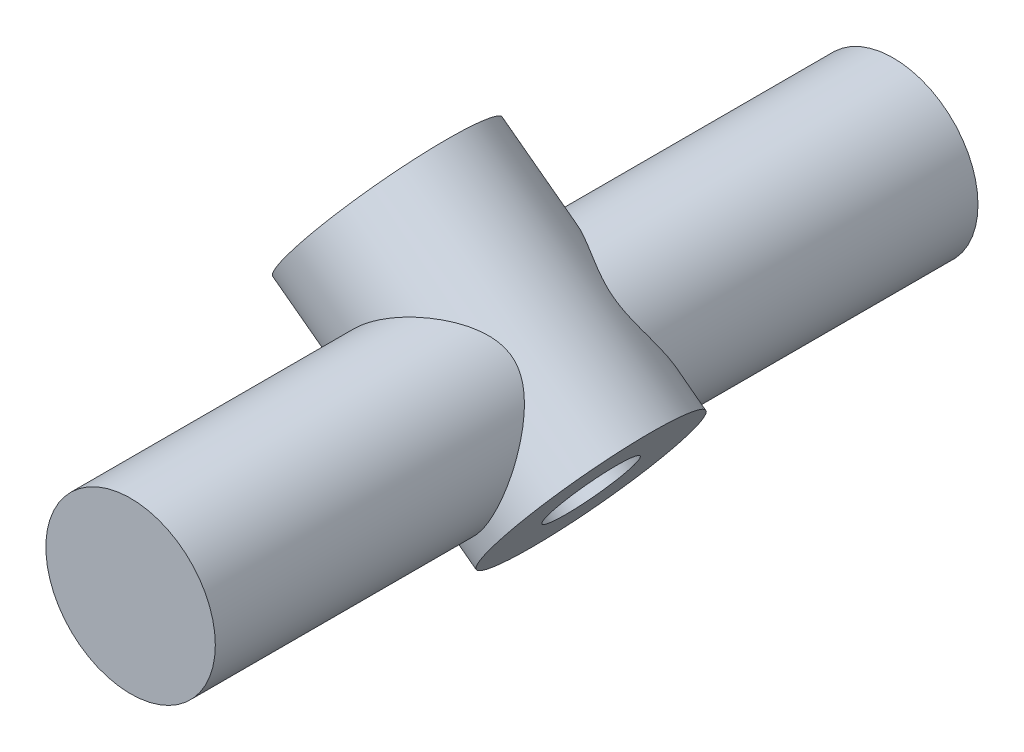
ISO-10303-21;
HEADER;
FILE_DESCRIPTION(('STEP AP214'),'2;1');
FILE_NAME('part.step','',(''),(''),'','','');
FILE_SCHEMA(('AUTOMOTIVE_DESIGN { 1 0 10303 214 1 1 1 1 }'));
ENDSEC;
DATA;
#1=APPLICATION_CONTEXT('core data for automotive mechanical design processes');
#2=APPLICATION_PROTOCOL_DEFINITION('international standard','automotive_design',2000,#1);
#3=PRODUCT_CONTEXT('',#1,'mechanical');
#4=PRODUCT('Part','Part','',(#3));
#5=PRODUCT_RELATED_PRODUCT_CATEGORY('part','',(#4));
#6=PRODUCT_DEFINITION_FORMATION('','',#4);
#7=PRODUCT_DEFINITION_CONTEXT('part definition',#1,'design');
#8=PRODUCT_DEFINITION('design','',#6,#7);
#9=PRODUCT_DEFINITION_SHAPE('','',#8);
#10=(LENGTH_UNIT() NAMED_UNIT(*) SI_UNIT(.MILLI.,.METRE.));
#11=(NAMED_UNIT(*) PLANE_ANGLE_UNIT() SI_UNIT($,.RADIAN.));
#12=(NAMED_UNIT(*) SI_UNIT($,.STERADIAN.) SOLID_ANGLE_UNIT());
#13=UNCERTAINTY_MEASURE_WITH_UNIT(LENGTH_MEASURE(1.E-05),#10,'distance_accuracy_value','');
#14=(GEOMETRIC_REPRESENTATION_CONTEXT(3) GLOBAL_UNCERTAINTY_ASSIGNED_CONTEXT((#13)) GLOBAL_UNIT_ASSIGNED_CONTEXT((#10,
#11,#12)) REPRESENTATION_CONTEXT('',''));
#15=CARTESIAN_POINT('',(0.,0.,0.));
#16=DIRECTION('',(0.,0.,1.));
#17=DIRECTION('',(1.,0.,0.));
#18=AXIS2_PLACEMENT_3D('',#15,#16,#17);
#19=CARTESIAN_POINT('',(-215.759160385557,344.756610233824,-27.));
#20=DIRECTION('',(0.,0.,1.));
#21=DIRECTION('',(1.,0.,0.));
#22=AXIS2_PLACEMENT_3D('',#19,#20,#21);
#23=CYLINDRICAL_SURFACE('',#22,6.00000000000001);
#24=CARTESIAN_POINT('',(-209.759160385557,344.756610233824,-6.00647164745907));
#25=CARTESIAN_POINT('',(-209.759159858271,344.948593905434,-5.91447663587483));
#26=CARTESIAN_POINT('',(-209.768371418057,345.138782135588,-5.8186259193337));
#27=CARTESIAN_POINT('',(-209.804243999186,345.514667969445,-5.62149603390164));
#28=CARTESIAN_POINT('',(-209.8309128451,345.700363520755,-5.5202144495263));
#29=CARTESIAN_POINT('',(-209.901121366976,346.067507634996,-5.31408722450067));
#30=CARTESIAN_POINT('',(-209.944728693377,346.248936034238,-5.20922885008379));
#31=CARTESIAN_POINT('',(-210.048421747259,346.606506576496,-4.99882773495179));
#32=CARTESIAN_POINT('',(-210.10850028618,346.782650988491,-4.89328531235097));
#33=CARTESIAN_POINT('',(-210.228797909086,347.087948865648,-4.7095229299941));
#34=CARTESIAN_POINT('',(-210.285507085904,347.21821392427,-4.63083744523253));
#35=CARTESIAN_POINT('',(-210.408786050194,347.475781172776,-4.47629668838633));
#36=CARTESIAN_POINT('',(-210.475357324651,347.603082912503,-4.40044184526197));
#37=CARTESIAN_POINT('',(-210.618632424391,347.854321516628,-4.25379998566272));
#38=CARTESIAN_POINT('',(-210.69530656222,347.978267004345,-4.18299902347914));
#39=CARTESIAN_POINT('',(-210.859500242439,348.222882098244,-4.04890148969238));
#40=CARTESIAN_POINT('',(-210.947012958609,348.34355370854,-3.98560024337552));
#41=CARTESIAN_POINT('',(-211.1544320968,348.607646267708,-3.85699658342909));
#42=CARTESIAN_POINT('',(-211.277221246331,348.750191045881,-3.79435214128499));
#43=CARTESIAN_POINT('',(-211.474471129644,348.957866042699,-3.71836269486118));
#44=CARTESIAN_POINT('',(-211.542348953018,349.026023744164,-3.69603803114081));
#45=CARTESIAN_POINT('',(-211.682308175847,349.159863176358,-3.65828682890597));
#46=CARTESIAN_POINT('',(-211.754387365384,349.225546179371,-3.64285670023001));
#47=CARTESIAN_POINT('',(-211.903181250009,349.354568828724,-3.61952771383037));
#48=CARTESIAN_POINT('',(-211.979937230506,349.417875956374,-3.61171104940692));
#49=CARTESIAN_POINT('',(-212.136758239871,349.54076366067,-3.60433802030662));
#50=CARTESIAN_POINT('',(-212.216823076003,349.600344453863,-3.60478117518142));
#51=CARTESIAN_POINT('',(-212.379552039737,349.715256762783,-3.61390407720157));
#52=CARTESIAN_POINT('',(-212.462217591644,349.770585890874,-3.62258841638526));
#53=CARTESIAN_POINT('',(-212.629373096039,349.876594338119,-3.64771818999826));
#54=CARTESIAN_POINT('',(-212.713864059663,349.927270994116,-3.66416803685714));
#55=CARTESIAN_POINT('',(-212.899785291929,350.032728195016,-3.70771772941904));
#56=CARTESIAN_POINT('',(-213.001444040587,350.086519686927,-3.73622911991726));
#57=CARTESIAN_POINT('',(-213.205584826696,350.187285260274,-3.80138227926526));
#58=CARTESIAN_POINT('',(-213.308067475727,350.234253664309,-3.83803075549561));
#59=CARTESIAN_POINT('',(-213.513607978219,350.321680368566,-3.91789737479342));
#60=CARTESIAN_POINT('',(-213.616666638258,350.362119539981,-3.9611341252705));
#61=CARTESIAN_POINT('',(-213.822802336345,350.436621209193,-4.05260149255457));
#62=CARTESIAN_POINT('',(-213.925879364181,350.470685222395,-4.10083091833606));
#63=CARTESIAN_POINT('',(-214.20151436605,350.553699448683,-4.23481105677626));
#64=CARTESIAN_POINT('',(-214.374077776183,350.597208808759,-4.32394192250417));
#65=CARTESIAN_POINT('',(-214.719297445024,350.668442857976,-4.50818389996287));
#66=CARTESIAN_POINT('',(-214.891953692639,350.696157447706,-4.60329879491396));
#67=CARTESIAN_POINT('',(-215.237740433117,350.73644706711,-4.79637103997042));
#68=CARTESIAN_POINT('',(-215.410871251562,350.749001574393,-4.89433205973189));
#69=CARTESIAN_POINT('',(-215.757407932876,350.759112427271,-5.09043486384047));
#70=CARTESIAN_POINT('',(-215.93081372361,350.756672209767,-5.18857660161047));
#71=CARTESIAN_POINT('',(-216.28639439189,350.736182213988,-5.3877824121314));
#72=CARTESIAN_POINT('',(-216.468579646611,350.717367934737,-5.48875163616689));
#73=CARTESIAN_POINT('',(-216.832758104092,350.662648665333,-5.68646141227863));
#74=CARTESIAN_POINT('',(-217.014751262974,350.62674037563,-5.78320114402428));
#75=CARTESIAN_POINT('',(-217.377239340965,350.537317912235,-5.97008018853172));
#76=CARTESIAN_POINT('',(-217.557736857007,350.483847640792,-6.06023528181702));
#77=CARTESIAN_POINT('',(-217.91639888987,350.358606159861,-6.23202850296414));
#78=CARTESIAN_POINT('',(-218.09456453088,350.286844138214,-6.31367087779082));
#79=CARTESIAN_POINT('',(-218.392686647987,350.149438014772,-6.4427705537816));
#80=CARTESIAN_POINT('',(-218.513705894415,350.088690702509,-6.49302312687098));
#81=CARTESIAN_POINT('',(-218.753076299836,349.95805677522,-6.58762374336629));
#82=CARTESIAN_POINT('',(-218.871428161373,349.888172600462,-6.63197335697164));
#83=CARTESIAN_POINT('',(-219.104630075343,349.739276796191,-6.71402137125864));
#84=CARTESIAN_POINT('',(-219.21948074301,349.660266782102,-6.75172094613065));
#85=CARTESIAN_POINT('',(-219.444715036771,349.493310025896,-6.81975321083471));
#86=CARTESIAN_POINT('',(-219.555100788681,349.405367608363,-6.85008944170994));
#87=CARTESIAN_POINT('',(-219.771229506971,349.220206465296,-6.90297634785517));
#88=CARTESIAN_POINT('',(-219.876933710721,349.122926008609,-6.92546990660069));
#89=CARTESIAN_POINT('',(-220.081807164013,348.920201168637,-6.96185517887692));
#90=CARTESIAN_POINT('',(-220.180976421702,348.814756795532,-6.97574690313176));
#91=CARTESIAN_POINT('',(-220.371745320491,348.596539330559,-6.9945895914405));
#92=CARTESIAN_POINT('',(-220.463347581818,348.483768799892,-6.99954366282681));
#93=CARTESIAN_POINT('',(-220.638129538941,348.251855310516,-7.00039593743066));
#94=CARTESIAN_POINT('',(-220.721309929685,348.132712878839,-6.99629488848925));
#95=CARTESIAN_POINT('',(-220.870311589157,347.901921542961,-6.98004159646666));
#96=CARTESIAN_POINT('',(-220.937038532873,347.790792033181,-6.96877620523247));
#97=CARTESIAN_POINT('',(-221.062831639844,347.565126624847,-6.93928819421719));
#98=CARTESIAN_POINT('',(-221.121895265833,347.450589613445,-6.9210632780261));
#99=CARTESIAN_POINT('',(-221.232092504991,347.219017251343,-6.87799775481005));
#100=CARTESIAN_POINT('',(-221.283228306581,347.101982600283,-6.85315897866011));
#101=CARTESIAN_POINT('',(-221.377515982412,346.866167515109,-6.79729752438298));
#102=CARTESIAN_POINT('',(-221.420664814467,346.74738643431,-6.76627249926165));
#103=CARTESIAN_POINT('',(-221.540695160261,346.381718429294,-6.6624142236383));
#104=CARTESIAN_POINT('',(-221.604579577354,346.133084435727,-6.58023702844769));
#105=CARTESIAN_POINT('',(-221.699604755759,345.636996731507,-6.39638638942296));
#106=CARTESIAN_POINT('',(-221.730734713972,345.389543437044,-6.29470652627032));
#107=CARTESIAN_POINT('',(-221.758368628146,344.962973873381,-6.10502209456553));
#108=CARTESIAN_POINT('',(-221.761758695785,344.782777842146,-6.02030951079804));
#109=CARTESIAN_POINT('',(-221.752695090741,344.425823719942,-5.84471441732249));
#110=CARTESIAN_POINT('',(-221.740240427143,344.249065844694,-5.75383152206506));
#111=CARTESIAN_POINT('',(-221.700176248336,343.89900639442,-5.5674166059827));
#112=CARTESIAN_POINT('',(-221.672513967593,343.725719043154,-5.47186945953159));
#113=CARTESIAN_POINT('',(-221.602558721917,343.383591207971,-5.27830680778514));
#114=CARTESIAN_POINT('',(-221.560268268297,343.214749966111,-5.18029172885204));
#115=CARTESIAN_POINT('',(-221.460319127498,342.878254856932,-4.98181490380185));
#116=CARTESIAN_POINT('',(-221.402367900583,342.71069349236,-4.88134365814771));
#117=CARTESIAN_POINT('',(-221.271365531515,342.380223459484,-4.68238434409162));
#118=CARTESIAN_POINT('',(-221.198307136395,342.217317068955,-4.58389725330123));
#119=CARTESIAN_POINT('',(-221.036783523802,341.896751284927,-4.39251587168615));
#120=CARTESIAN_POINT('',(-220.948372723991,341.739075626156,-4.29960333618369));
#121=CARTESIAN_POINT('',(-220.755012131261,341.428715810968,-4.12349614686668));
#122=CARTESIAN_POINT('',(-220.650082607611,341.276025810572,-4.0402897981276));
#123=CARTESIAN_POINT('',(-220.424411087476,340.979124815451,-3.89114953062832));
#124=CARTESIAN_POINT('',(-220.304034989525,340.834804430967,-3.8248981186523));
#125=CARTESIAN_POINT('',(-220.110216051287,340.624128122568,-3.74268024418843));
#126=CARTESIAN_POINT('',(-220.043459566578,340.554923357893,-3.71814700359334));
#127=CARTESIAN_POINT('',(-219.905622918109,340.418844144823,-3.67574691211203));
#128=CARTESIAN_POINT('',(-219.834545019292,340.351968504107,-3.65787660348516));
#129=CARTESIAN_POINT('',(-219.687472180485,340.220287540374,-3.62947481990895));
#130=CARTESIAN_POINT('',(-219.611428246185,340.155516949553,-3.61903452957399));
#131=CARTESIAN_POINT('',(-219.455773332999,340.029552653851,-3.60642726278701));
#132=CARTESIAN_POINT('',(-219.376162651854,339.968358651386,-3.60425959706073));
#133=CARTESIAN_POINT('',(-219.214088487381,339.850131243976,-3.60832485392698));
#134=CARTESIAN_POINT('',(-219.131624280996,339.793098905108,-3.61455992110577));
#135=CARTESIAN_POINT('',(-218.964620731158,339.683642464384,-3.63507666911775));
#136=CARTESIAN_POINT('',(-218.88008028501,339.631220882109,-3.64936271827031));
#137=CARTESIAN_POINT('',(-218.69771500465,339.524250753239,-3.687754703712));
#138=CARTESIAN_POINT('',(-218.599691786493,339.470437247869,-3.71295789286757));
#139=CARTESIAN_POINT('',(-218.402694225675,339.369216409363,-3.77142101301842));
#140=CARTESIAN_POINT('',(-218.303719201083,339.321814103271,-3.80468720983686));
#141=CARTESIAN_POINT('',(-218.105110724999,339.233171090331,-3.87784148606014));
#142=CARTESIAN_POINT('',(-218.005476198344,339.191948509933,-3.91774834844116));
#143=CARTESIAN_POINT('',(-217.806134248811,339.115574132088,-4.00269544360038));
#144=CARTESIAN_POINT('',(-217.706426846165,339.080421033773,-4.04773457293988));
#145=CARTESIAN_POINT('',(-217.439855414804,338.994141524659,-4.17338722236864));
#146=CARTESIAN_POINT('',(-217.272972898945,338.948195134383,-4.25753622351755));
#147=CARTESIAN_POINT('',(-216.939166298955,338.871294435975,-4.43239029199889));
#148=CARTESIAN_POINT('',(-216.772242260179,338.840350050726,-4.52309965314518));
#149=CARTESIAN_POINT('',(-216.437985401882,338.792742004405,-4.70798715610268));
#150=CARTESIAN_POINT('',(-216.270652337613,338.776098486845,-4.80216999651638));
#151=CARTESIAN_POINT('',(-215.935739837939,338.75686498243,-4.9914127910159));
#152=CARTESIAN_POINT('',(-215.768160468645,338.754271738416,-5.08647253669702));
#153=CARTESIAN_POINT('',(-215.422721036166,338.763412737118,-5.28115655833267));
#154=CARTESIAN_POINT('',(-215.244845063938,338.776012445772,-5.38071413047635));
#155=CARTESIAN_POINT('',(-214.889087577021,338.817330946008,-5.57653831294002));
#156=CARTESIAN_POINT('',(-214.711206066921,338.846052589966,-5.67280433770428));
#157=CARTESIAN_POINT('',(-214.356506554987,338.920061004817,-5.85983205896735));
#158=CARTESIAN_POINT('',(-214.179687046037,338.965309384258,-5.95060594852192));
#159=CARTESIAN_POINT('',(-213.827664605067,339.073021286913,-6.12491879989516));
#160=CARTESIAN_POINT('',(-213.652461593187,339.135483954924,-6.20845812085507));
#161=CARTESIAN_POINT('',(-213.352537609025,339.258719055204,-6.34469923358174));
#162=CARTESIAN_POINT('',(-213.227083529484,339.315304256274,-6.39959658151361));
#163=CARTESIAN_POINT('',(-212.978510941205,339.438039852364,-6.50365773552214));
#164=CARTESIAN_POINT('',(-212.855391853686,339.504187841028,-6.55282297840512));
#165=CARTESIAN_POINT('',(-212.612308282845,339.646118464223,-6.64460845088783));
#166=CARTESIAN_POINT('',(-212.492343450518,339.721900027376,-6.68722940713412));
#167=CARTESIAN_POINT('',(-212.256552892906,339.88299601457,-6.7651224640722));
#168=CARTESIAN_POINT('',(-212.140725467603,339.968306462414,-6.800397612539));
#169=CARTESIAN_POINT('',(-211.913285175618,340.148953403415,-6.86314226006092));
#170=CARTESIAN_POINT('',(-211.801714212646,340.244365746207,-6.89054599026212));
#171=CARTESIAN_POINT('',(-211.584921066561,340.444134269169,-6.93652674027109));
#172=CARTESIAN_POINT('',(-211.479698893163,340.548490463023,-6.95510374657244));
#173=CARTESIAN_POINT('',(-211.276782213824,340.765329676951,-6.98296050653346));
#174=CARTESIAN_POINT('',(-211.179083240596,340.877807796106,-6.99224581753072));
#175=CARTESIAN_POINT('',(-210.992174907397,341.109961168751,-7.00129540243451));
#176=CARTESIAN_POINT('',(-210.902964606742,341.229635622364,-7.00106073254586));
#177=CARTESIAN_POINT('',(-210.744070242053,341.460240116029,-6.99168411320818));
#178=CARTESIAN_POINT('',(-210.673328365699,341.570488782362,-6.98361772559976));
#179=CARTESIAN_POINT('',(-210.539484761546,341.794844877303,-6.9602900948237));
#180=CARTESIAN_POINT('',(-210.476385588883,341.908953580191,-6.94502645374338));
#181=CARTESIAN_POINT('',(-210.358157785337,342.140120061465,-6.90759601141077));
#182=CARTESIAN_POINT('',(-210.303028865989,342.257177732939,-6.88542946008465));
#183=CARTESIAN_POINT('',(-210.200873804957,342.493418045223,-6.83460086124124));
#184=CARTESIAN_POINT('',(-210.15385069813,342.612601463573,-6.80593639012897));
#185=CARTESIAN_POINT('',(-210.023963549355,342.975087573444,-6.71011624925312));
#186=CARTESIAN_POINT('',(-209.953687588985,343.220551444202,-6.63359641783344));
#187=CARTESIAN_POINT('',(-209.845611463672,343.711093960038,-6.46050969105933));
#188=CARTESIAN_POINT('',(-209.80778756754,343.956172755574,-6.36395750901592));
#189=CARTESIAN_POINT('',(-209.776377063291,344.292768045484,-6.2196664232556));
#190=CARTESIAN_POINT('',(-209.769889842621,344.386070928611,-6.17840664496717));
#191=CARTESIAN_POINT('',(-209.761282638038,344.571923577055,-6.09388385554417));
#192=CARTESIAN_POINT('',(-209.759160638611,344.664473670278,-6.05062177835141));
#193=CARTESIAN_POINT('',(-209.759160385557,344.756610233824,-6.00647164745907));
#194=B_SPLINE_CURVE_WITH_KNOTS('',3,(#24,#25,#26,#27,#28,#29,#30,#31,#32,#33,#34,#35,#36,#37,
#38,#39,#40,#41,#42,#43,#44,#45,#46,#47,#48,#49,#50,#51,#52,#53,#54,#55,#56,#57,#58,#59,#60,#61,
#62,#63,#64,#65,#66,#67,#68,#69,#70,#71,#72,#73,#74,#75,#76,#77,#78,#79,#80,#81,#82,#83,#84,#85,
#86,#87,#88,#89,#90,#91,#92,#93,#94,#95,#96,#97,#98,#99,#100,#101,#102,#103,#104,#105,#106,#107,
#108,#109,#110,#111,#112,#113,#114,#115,#116,#117,#118,#119,#120,#121,#122,#123,#124,#125,#126,
#127,#128,#129,#130,#131,#132,#133,#134,#135,#136,#137,#138,#139,#140,#141,#142,#143,#144,#145,
#146,#147,#148,#149,#150,#151,#152,#153,#154,#155,#156,#157,#158,#159,#160,#161,#162,#163,#164,
#165,#166,#167,#168,#169,#170,#171,#172,#173,#174,#175,#176,#177,#178,#179,#180,#181,#182,#183,
#184,#185,#186,#187,#188,#189,#190,#191,#192,#193),.UNSPECIFIED.,.T.,.F.,(4,2,2,2,2,2,2,2,2,2,2,
2,2,2,2,2,2,2,2,2,2,2,2,2,2,2,2,2,2,2,2,2,2,2,2,2,2,2,2,2,2,2,2,2,2,2,2,2,2,2,2,2,2,2,2,2,2,2,2,
2,2,2,2,2,2,2,2,2,2,2,2,2,2,2,2,2,2,2,2,2,2,2,2,2,4),(0.,0.638543681669805,1.27737376262765,
1.91878193877723,2.55991062843823,3.04682251579054,3.53380789340605,4.01939290472295,
4.50467363138363,5.09736067704938,5.3933079963237,5.68910102811637,5.98805310423766,
6.28698779128889,6.58608914444176,6.88536065454612,7.24027975316789,7.59549250413024,
7.95172775087086,8.30787821104924,8.90407050141838,9.50064357949907,10.0980233438299,
10.6952661894722,11.321987326427,11.948829484576,12.5741164112812,13.199089876736,
13.6320073098818,14.0648093549672,14.4975349039888,14.930051940504,15.3656561555301,
15.8012598274767,16.2367120249293,16.6721282607559,17.0620084277262,17.4520173534031,
17.8419184272985,18.2319677077528,19.0372982111429,19.8428942460076,20.4395705280719,
21.0362841275817,21.6350813189168,22.2337757618429,22.8445356813048,23.4555895108329,
24.0645200539085,24.6727091516559,25.2685015861546,25.5659201288609,25.8631841101349,
26.1640361234326,26.4648630692234,26.765766808069,27.0668339693287,27.4101787147485,
27.7537911362341,28.0983925137117,28.4429199410996,29.0194044608641,29.5962697703911,
30.1739462987319,30.7514889033333,31.3635452246306,31.9757098682008,32.5864614104868,
33.1971826162095,33.6413016083915,34.085309037515,34.5292671304508,34.9730406565958,
35.4204208617249,35.8678017514203,36.3149149036125,36.7619784504769,37.1552293331254,
37.5486113280499,37.9419790818763,38.3354937961681,39.1318497341738,39.9276228242082,
40.2342135002867,40.5406625853046),.UNSPECIFIED.);
#195=CARTESIAN_POINT('',(-209.759160385557,344.756610233824,-6.00647164745907));
#196=VERTEX_POINT('',#195);
#197=EDGE_CURVE('E11',#196,#196,#194,.T.);
#198=ORIENTED_EDGE('',*,*,#197,.F.);
#199=EDGE_LOOP('',(#198));
#200=FACE_BOUND('',#199,.T.);
#201=CARTESIAN_POINT('',(-215.759160385557,344.756610233824,-27.));
#202=DIRECTION('',(0.,0.,1.));
#203=DIRECTION('',(1.,0.,0.));
#204=AXIS2_PLACEMENT_3D('',#201,#202,#203);
#205=CIRCLE('',#204,6.00000000000001);
#206=CARTESIAN_POINT('',(-209.759160385557,344.756610233824,-27.));
#207=VERTEX_POINT('',#206);
#208=EDGE_CURVE('E116',#207,#207,#205,.T.);
#209=ORIENTED_EDGE('',*,*,#208,.T.);
#210=EDGE_LOOP('',(#209));
#211=FACE_BOUND('',#210,.T.);
#212=ADVANCED_FACE('F53',(#200,#211),#23,.T.);
#213=CARTESIAN_POINT('',(-215.759160385557,344.756610233824,-27.));
#214=DIRECTION('',(0.,0.,1.));
#215=DIRECTION('',(1.,0.,0.));
#216=AXIS2_PLACEMENT_3D('',#213,#214,#215);
#217=PLANE('',#216);
#218=ORIENTED_EDGE('',*,*,#208,.F.);
#219=EDGE_LOOP('',(#218));
#220=FACE_BOUND('',#219,.T.);
#221=ADVANCED_FACE('F55',(#220),#217,.F.);
#222=CARTESIAN_POINT('',(-210.154580460435,340.562723747172,0.));
#223=DIRECTION('',(-0.800654275017385,0.599126640950297,0.));
#224=DIRECTION('',(-0.599126640950297,-0.800654275017385,0.));
#225=AXIS2_PLACEMENT_3D('',#222,#223,#224);
#226=PLANE('',#225);
#227=CARTESIAN_POINT('',(-210.154580460435,340.562723747172,0.));
#228=DIRECTION('',(-0.800654275017385,0.599126640950297,0.));
#229=DIRECTION('',(-0.599126640950297,-0.800654275017385,0.));
#230=AXIS2_PLACEMENT_3D('',#227,#228,#229);
#231=CIRCLE('',#230,3.);
#232=CARTESIAN_POINT('',(-211.951960383286,338.16076092212,0.));
#233=VERTEX_POINT('',#232);
#234=EDGE_CURVE('E126',#233,#233,#231,.T.);
#235=ORIENTED_EDGE('',*,*,#234,.T.);
#236=EDGE_LOOP('',(#235));
#237=FACE_BOUND('',#236,.T.);
#238=CARTESIAN_POINT('',(-210.154580460435,340.562723747172,0.));
#239=DIRECTION('',(-0.800654275017385,0.599126640950297,0.));
#240=DIRECTION('',(-0.599126640950297,-0.800654275017385,0.));
#241=AXIS2_PLACEMENT_3D('',#238,#239,#240);
#242=CIRCLE('',#241,7.);
#243=CARTESIAN_POINT('',(-214.348466947087,334.95814382205,0.));
#244=VERTEX_POINT('',#243);
#245=EDGE_CURVE('E123',#244,#244,#242,.T.);
#246=ORIENTED_EDGE('',*,*,#245,.F.);
#247=EDGE_LOOP('',(#246));
#248=FACE_BOUND('',#247,.T.);
#249=ADVANCED_FACE('F89',(#237,#248),#226,.F.);
#250=CARTESIAN_POINT('',(-224.566357410748,351.347003284277,0.));
#251=DIRECTION('',(-0.800654275017385,0.599126640950297,0.));
#252=DIRECTION('',(-0.599126640950297,-0.800654275017385,0.));
#253=AXIS2_PLACEMENT_3D('',#250,#251,#252);
#254=PLANE('',#253);
#255=CARTESIAN_POINT('',(-224.566357410748,351.347003284278,0.));
#256=DIRECTION('',(-0.800654275017385,0.599126640950297,0.));
#257=DIRECTION('',(-0.599126640950297,-0.800654275017385,0.));
#258=AXIS2_PLACEMENT_3D('',#255,#256,#257);
#259=CIRCLE('',#258,3.);
#260=CARTESIAN_POINT('',(-226.363737333599,348.945040459225,0.));
#261=VERTEX_POINT('',#260);
#262=EDGE_CURVE('E57',#261,#261,#259,.T.);
#263=ORIENTED_EDGE('',*,*,#262,.F.);
#264=EDGE_LOOP('',(#263));
#265=FACE_BOUND('',#264,.T.);
#266=CARTESIAN_POINT('',(-224.566357410748,351.347003284277,0.));
#267=DIRECTION('',(-0.800654275017385,0.599126640950297,0.));
#268=DIRECTION('',(-0.599126640950297,-0.800654275017385,0.));
#269=AXIS2_PLACEMENT_3D('',#266,#267,#268);
#270=CIRCLE('',#269,7.);
#271=CARTESIAN_POINT('',(-228.7602438974,345.742423359156,0.));
#272=VERTEX_POINT('',#271);
#273=EDGE_CURVE('E118',#272,#272,#270,.T.);
#274=ORIENTED_EDGE('',*,*,#273,.T.);
#275=EDGE_LOOP('',(#274));
#276=FACE_BOUND('',#275,.T.);
#277=ADVANCED_FACE('F85',(#265,#276),#254,.T.);
#278=CARTESIAN_POINT('',(-210.154580460435,340.562723747172,0.));
#279=DIRECTION('',(-0.800654275017384,0.599126640950298,0.));
#280=DIRECTION('',(-0.599126640950298,-0.800654275017384,0.));
#281=AXIS2_PLACEMENT_3D('',#278,#279,#280);
#282=CYLINDRICAL_SURFACE('',#281,7.);
#283=ORIENTED_EDGE('',*,*,#197,.T.);
#284=EDGE_LOOP('',(#283));
#285=FACE_BOUND('',#284,.T.);
#286=CARTESIAN_POINT('',(-209.759160385557,344.756610233824,6.00647164745908));
#287=CARTESIAN_POINT('',(-209.759172643724,344.479170803991,6.13940388333191));
#288=CARTESIAN_POINT('',(-209.77842491703,344.197621905171,6.26443874342129));
#289=CARTESIAN_POINT('',(-209.83862793863,343.772831633001,6.43461724166157));
#290=CARTESIAN_POINT('',(-209.863947735942,343.630714171392,6.48848228007201));
#291=CARTESIAN_POINT('',(-209.92541445573,343.34646002985,6.58950059199469));
#292=CARTESIAN_POINT('',(-209.961556185851,343.204323391734,6.63665706829947));
#293=CARTESIAN_POINT('',(-210.04533939983,342.91963577437,6.72377141444047));
#294=CARTESIAN_POINT('',(-210.09308625731,342.777093557742,6.76365709972999));
#295=CARTESIAN_POINT('',(-210.199990008247,342.494206848878,6.83478209742143));
#296=CARTESIAN_POINT('',(-210.259141144645,342.353861286223,6.86602575316255));
#297=CARTESIAN_POINT('',(-210.38870650252,342.076760035283,6.91910639083292));
#298=CARTESIAN_POINT('',(-210.459111409561,341.940001486156,6.94095109728866));
#299=CARTESIAN_POINT('',(-210.610833819493,341.671401588907,6.97468936391971));
#300=CARTESIAN_POINT('',(-210.692149695684,341.539559511533,6.98658440556734));
#301=CARTESIAN_POINT('',(-210.85446427644,341.297927424728,6.99927485437909));
#302=CARTESIAN_POINT('',(-210.934291705531,341.187409226869,7.00124723044749));
#303=CARTESIAN_POINT('',(-211.101212800735,340.972159380132,6.99723233049387));
#304=CARTESIAN_POINT('',(-211.188306091661,340.867427432931,6.99124546522581));
#305=CARTESIAN_POINT('',(-211.369006039905,340.664544751035,6.97144256966588));
#306=CARTESIAN_POINT('',(-211.46261245284,340.56639376968,6.95762683298954));
#307=CARTESIAN_POINT('',(-211.655512310503,340.37730471415,6.92245945951619));
#308=CARTESIAN_POINT('',(-211.754805836003,340.286366742464,6.90110771566542));
#309=CARTESIAN_POINT('',(-211.953327260705,340.116364704523,6.85249180962733));
#310=CARTESIAN_POINT('',(-212.05232864207,340.036939915566,6.82556139067209));
#311=CARTESIAN_POINT('',(-212.253989866145,339.885293982513,6.76571338254862));
#312=CARTESIAN_POINT('',(-212.356651070164,339.813075557655,6.73279354647277));
#313=CARTESIAN_POINT('',(-212.669085038221,339.607486073714,6.62578614247509));
#314=CARTESIAN_POINT('',(-212.883410602927,339.485093914531,6.54342495102356));
#315=CARTESIAN_POINT('',(-213.253527914194,339.302179541208,6.38855738227875));
#316=CARTESIAN_POINT('',(-213.407598683518,339.234110289068,6.32050244945905));
#317=CARTESIAN_POINT('',(-213.718050600294,339.111996084765,6.17724145001796));
#318=CARTESIAN_POINT('',(-213.874432525907,339.057955975387,6.10203292622428));
#319=CARTESIAN_POINT('',(-214.188695898263,338.963456715351,5.94581885505726));
#320=CARTESIAN_POINT('',(-214.346579385896,338.923020014636,5.86480399000762));
#321=CARTESIAN_POINT('',(-214.662889372969,338.855394890877,5.69849952280911));
#322=CARTESIAN_POINT('',(-214.82131581956,338.82820521335,5.61321032628002));
#323=CARTESIAN_POINT('',(-215.141089973132,338.786312092295,5.43819631477827));
#324=CARTESIAN_POINT('',(-215.302439290733,338.771840464824,5.34841947083945));
#325=CARTESIAN_POINT('',(-215.6249717664,338.755937761862,5.16739581032848));
#326=CARTESIAN_POINT('',(-215.786154899621,338.754508414314,5.07614880058173));
#327=CARTESIAN_POINT('',(-216.108165117657,338.764604142914,4.89392925209892));
#328=CARTESIAN_POINT('',(-216.268992346215,338.776122331706,4.80295659322408));
#329=CARTESIAN_POINT('',(-216.590381065721,338.812267829816,4.62329268672083));
#330=CARTESIAN_POINT('',(-216.750942620738,338.836891296129,4.5346007782715));
#331=CARTESIAN_POINT('',(-217.131640631163,338.911381466404,4.32991018338399));
#332=CARTESIAN_POINT('',(-217.351781429885,338.967223989571,4.21598709170481));
#333=CARTESIAN_POINT('',(-217.79201170329,339.106767903442,4.00646960094608));
#334=CARTESIAN_POINT('',(-218.012100736104,339.190426311753,3.9108472796589));
#335=CARTESIAN_POINT('',(-218.397371153803,339.364684381388,3.77127775834869));
#336=CARTESIAN_POINT('',(-218.562910598309,339.448667929352,3.72042106530476));
#337=CARTESIAN_POINT('',(-218.807868101381,339.588029852574,3.66354270578533));
#338=CARTESIAN_POINT('',(-218.88890952354,339.636678354663,3.64782169422753));
#339=CARTESIAN_POINT('',(-219.049334341212,339.738268715292,3.62351253582202));
#340=CARTESIAN_POINT('',(-219.128718465303,339.791208635038,3.6149211874056));
#341=CARTESIAN_POINT('',(-219.285657060543,339.901399367511,3.60528370195087));
#342=CARTESIAN_POINT('',(-219.36319709079,339.958674931847,3.6042847992138));
#343=CARTESIAN_POINT('',(-219.515244298053,340.076749141466,3.61000763303692));
#344=CARTESIAN_POINT('',(-219.589751476926,340.137547784593,3.61672936487006));
#345=CARTESIAN_POINT('',(-219.735259029433,340.262188421234,3.63755342497268));
#346=CARTESIAN_POINT('',(-219.806254675832,340.326034301454,3.65166542114595));
#347=CARTESIAN_POINT('',(-219.94427362108,340.45616335824,3.68659360306484));
#348=CARTESIAN_POINT('',(-220.011294622508,340.522447909222,3.7074136223052));
#349=CARTESIAN_POINT('',(-220.249436555896,340.769187713615,3.79451295466015));
#350=CARTESIAN_POINT('',(-220.407882487459,340.955798852871,3.87872327988149));
#351=CARTESIAN_POINT('',(-220.623625325049,341.242149190523,4.02369127574221));
#352=CARTESIAN_POINT('',(-220.692011045938,341.338890969092,4.07525648370897));
#353=CARTESIAN_POINT('',(-220.821891213089,341.534423570426,4.18304250310778));
#354=CARTESIAN_POINT('',(-220.88338677424,341.633214058616,4.23926255877682));
#355=CARTESIAN_POINT('',(-221.036873757685,341.896269136561,4.39184253966076));
#356=CARTESIAN_POINT('',(-221.123338411628,342.062155066292,4.49095944318062));
#357=CARTESIAN_POINT('',(-221.279714250897,342.399074542613,4.69352551239258));
#358=CARTESIAN_POINT('',(-221.349615539303,342.570111098357,4.79697722499103));
#359=CARTESIAN_POINT('',(-221.47325791946,342.917306526075,5.00492495474759));
#360=CARTESIAN_POINT('',(-221.526999292707,343.093465308763,5.1094209536821));
#361=CARTESIAN_POINT('',(-221.618240240345,343.450788990255,5.31680816860101));
#362=CARTESIAN_POINT('',(-221.655745553586,343.631952096088,5.41969993920463));
#363=CARTESIAN_POINT('',(-221.709915796354,343.973069616084,5.60731232308019));
#364=CARTESIAN_POINT('',(-221.728780615983,344.132392123127,5.69254197367125));
#365=CARTESIAN_POINT('',(-221.753711721013,344.45422230127,5.85876833875565));
#366=CARTESIAN_POINT('',(-221.759774535559,344.616730824105,5.93976389950702));
#367=CARTESIAN_POINT('',(-221.757790845735,345.107687874038,6.17398914253559));
#368=CARTESIAN_POINT('',(-221.729721701163,345.440470249327,6.31896688170697));
#369=CARTESIAN_POINT('',(-221.626686930857,346.038675063873,6.54769971722183));
#370=CARTESIAN_POINT('',(-221.562853154061,346.303510771747,6.63791822091538));
#371=CARTESIAN_POINT('',(-221.438256901383,346.697458952634,6.75287430742062));
#372=CARTESIAN_POINT('',(-221.391900331945,346.828259989467,6.78780459493225));
#373=CARTESIAN_POINT('',(-221.289524384902,347.087812998884,6.85022112627412));
#374=CARTESIAN_POINT('',(-221.233509174245,347.216565829052,6.87771056715903));
#375=CARTESIAN_POINT('',(-221.111521874156,347.47182086354,6.92482941952703));
#376=CARTESIAN_POINT('',(-221.04548723045,347.59830291335,6.94440640019696));
#377=CARTESIAN_POINT('',(-220.904051951134,347.847006770844,6.97499715119632));
#378=CARTESIAN_POINT('',(-220.828651297257,347.969228570218,6.98601090482365));
#379=CARTESIAN_POINT('',(-220.669044185698,348.208230816224,6.99920800525619));
#380=CARTESIAN_POINT('',(-220.584840360112,348.325012874296,7.0013939838109));
#381=CARTESIAN_POINT('',(-220.408343229154,348.552104291276,6.99688843723403));
#382=CARTESIAN_POINT('',(-220.316050514188,348.662414121611,6.99019755951762));
#383=CARTESIAN_POINT('',(-220.133842784017,348.864994716454,6.96920845427182));
#384=CARTESIAN_POINT('',(-220.044609398065,348.957967167604,6.95573590581776));
#385=CARTESIAN_POINT('',(-219.860991790603,349.137416617039,6.92198605031437));
#386=CARTESIAN_POINT('',(-219.766605880695,349.223891463838,6.90170650137737));
#387=CARTESIAN_POINT('',(-219.573470217129,349.389886328113,6.85471286156284));
#388=CARTESIAN_POINT('',(-219.474721523076,349.469408020501,6.82800032614937));
#389=CARTESIAN_POINT('',(-219.273552509775,349.621274316047,6.76858917588293));
#390=CARTESIAN_POINT('',(-219.171130815263,349.693616191886,6.73588829962268));
#391=CARTESIAN_POINT('',(-218.849662282183,349.906044824706,6.62621602192982));
#392=CARTESIAN_POINT('',(-218.625476794783,350.033774942843,6.53991657700497));
#393=CARTESIAN_POINT('',(-218.169617811194,350.256998957358,6.34825357590798));
#394=CARTESIAN_POINT('',(-217.937942474928,350.352484865138,6.24288530529562));
#395=CARTESIAN_POINT('',(-217.530515256782,350.492124409413,6.04672482069556));
#396=CARTESIAN_POINT('',(-217.3555532894,350.543158193278,5.95905828715191));
#397=CARTESIAN_POINT('',(-217.004650126912,350.62869439964,5.77782014531796));
#398=CARTESIAN_POINT('',(-216.828708870394,350.663195773292,5.68424816280168));
#399=CARTESIAN_POINT('',(-216.475883397028,350.716331397014,5.49273161849833));
#400=CARTESIAN_POINT('',(-216.298998297793,350.734899180889,5.39477051683473));
#401=CARTESIAN_POINT('',(-215.945457634002,350.756331460748,5.19684631741669));
#402=CARTESIAN_POINT('',(-215.768802031883,350.759198972246,5.09688360780838));
#403=CARTESIAN_POINT('',(-215.41219161168,350.749279889461,4.89507822324775));
#404=CARTESIAN_POINT('',(-215.232243632316,350.736170251034,4.79323914948467));
#405=CARTESIAN_POINT('',(-214.872486360488,350.693499400339,4.59249655962937));
#406=CARTESIAN_POINT('',(-214.692677218453,350.663928209317,4.49359486247411));
#407=CARTESIAN_POINT('',(-214.33391515689,350.587745750794,4.30296703795112));
#408=CARTESIAN_POINT('',(-214.154962252659,350.541216604249,4.21120887335844));
#409=CARTESIAN_POINT('',(-213.797238429427,350.429873976273,4.03960790868559));
#410=CARTESIAN_POINT('',(-213.618467665065,350.365089279755,3.959746650485));
#411=CARTESIAN_POINT('',(-213.271949499474,350.219836299474,3.82312376023704));
#412=CARTESIAN_POINT('',(-213.104172985152,350.140516460255,3.76527865706484));
#413=CARTESIAN_POINT('',(-212.855083678193,350.007818447297,3.69673893273968));
#414=CARTESIAN_POINT('',(-212.772554607552,349.961346283403,3.67693977188174));
#415=CARTESIAN_POINT('',(-212.608821236944,349.863901481576,3.64421532920635));
#416=CARTESIAN_POINT('',(-212.527616314628,349.812931034555,3.63128672236028));
#417=CARTESIAN_POINT('',(-212.366427743093,349.70623560467,3.61285448289752));
#418=CARTESIAN_POINT('',(-212.28646203668,349.650471428283,3.60741978480621));
#419=CARTESIAN_POINT('',(-212.129257111385,349.535031613007,3.60449438040858));
#420=CARTESIAN_POINT('',(-212.052017780105,349.475356135659,3.60700334622344));
#421=CARTESIAN_POINT('',(-211.900863620797,349.352590691212,3.61983193443585));
#422=CARTESIAN_POINT('',(-211.826952090316,349.289497468108,3.63015913104391));
#423=CARTESIAN_POINT('',(-211.683007444981,349.160509352937,3.65809502482095));
#424=CARTESIAN_POINT('',(-211.612976548418,349.094612895731,3.67570783896724));
#425=CARTESIAN_POINT('',(-211.460820075398,348.944482059146,3.72240928640443));
#426=CARTESIAN_POINT('',(-211.379826809409,348.859642989018,3.7532377941778));
#427=CARTESIAN_POINT('',(-211.224453208528,348.687248960847,3.82306803246486));
#428=CARTESIAN_POINT('',(-211.150078653064,348.599691717555,3.86207680811523));
#429=CARTESIAN_POINT('',(-211.007641534024,348.422134270158,3.94663700949035));
#430=CARTESIAN_POINT('',(-210.939600181428,348.332127075695,3.99220920480387));
#431=CARTESIAN_POINT('',(-210.809857045324,348.150261567205,4.08824945514277));
#432=CARTESIAN_POINT('',(-210.748153646666,348.058403731964,4.13871625643144));
#433=CARTESIAN_POINT('',(-210.591372812767,347.81072652507,4.27833787199658));
#434=CARTESIAN_POINT('',(-210.501665398354,347.653326249977,4.37074033997101));
#435=CARTESIAN_POINT('',(-210.337864520841,347.333780035836,4.5611038495994));
#436=CARTESIAN_POINT('',(-210.263781983381,347.171630865776,4.65906872039068));
#437=CARTESIAN_POINT('',(-210.130727841647,346.842792786052,4.85714574935223));
#438=CARTESIAN_POINT('',(-210.071739766941,346.676109046012,4.95725543676001));
#439=CARTESIAN_POINT('',(-209.96865338084,346.338136626182,5.15712240459929));
#440=CARTESIAN_POINT('',(-209.924547180044,346.166850438475,5.25687984392471));
#441=CARTESIAN_POINT('',(-209.845770433671,345.79283042318,5.46920771246012));
#442=CARTESIAN_POINT('',(-209.813610992275,345.589327016565,5.58137614698182));
#443=CARTESIAN_POINT('',(-209.770304634146,345.176879414233,5.79937960445391));
#444=CARTESIAN_POINT('',(-209.759151048461,344.967936966671,5.90521662716924));
#445=CARTESIAN_POINT('',(-209.759160385557,344.756610233824,6.00647164745908));
#446=B_SPLINE_CURVE_WITH_KNOTS('',3,(#286,#287,#288,#289,#290,#291,#292,#293,#294,#295,#296,
#297,#298,#299,#300,#301,#302,#303,#304,#305,#306,#307,#308,#309,#310,#311,#312,#313,#314,#315,
#316,#317,#318,#319,#320,#321,#322,#323,#324,#325,#326,#327,#328,#329,#330,#331,#332,#333,#334,
#335,#336,#337,#338,#339,#340,#341,#342,#343,#344,#345,#346,#347,#348,#349,#350,#351,#352,#353,
#354,#355,#356,#357,#358,#359,#360,#361,#362,#363,#364,#365,#366,#367,#368,#369,#370,#371,#372,
#373,#374,#375,#376,#377,#378,#379,#380,#381,#382,#383,#384,#385,#386,#387,#388,#389,#390,#391,
#392,#393,#394,#395,#396,#397,#398,#399,#400,#401,#402,#403,#404,#405,#406,#407,#408,#409,#410,
#411,#412,#413,#414,#415,#416,#417,#418,#419,#420,#421,#422,#423,#424,#425,#426,#427,#428,#429,
#430,#431,#432,#433,#434,#435,#436,#437,#438,#439,#440,#441,#442,#443,#444,#445),.UNSPECIFIED.,
.T.,.F.,(4,2,2,2,2,2,2,2,2,2,2,2,2,2,2,2,2,2,2,2,2,2,2,2,2,2,2,2,2,2,2,2,2,2,2,2,2,2,2,2,2,2,2,
2,2,2,2,2,2,2,2,2,2,2,2,2,2,2,2,2,2,2,2,2,2,2,2,2,2,2,2,2,2,2,2,2,2,2,2,4),(0.,
0.922205034607231,1.38401391277244,1.84560156950702,2.31154817829154,2.77726018285176,
3.24258870749869,3.70784793392147,4.11635352053344,4.52483802614449,4.9333072128869,
5.34178220242749,5.73061178559135,6.1195875386332,6.89713285704609,7.4415053736944,
7.98606555567302,8.53152007601153,9.07692293219192,9.63207231517558,10.1872952475376,
10.7422229724613,11.2969880593957,12.0575532182586,12.8169485366517,13.3919792757168,
13.6791152677676,13.966122251787,14.254913320322,14.5437042120413,14.8328738456875,
15.1222090277171,15.893782696692,16.2812737913275,16.6687020956553,17.3029193112982,
17.9375145333429,18.5720987004769,19.2064583818961,19.7509371988448,20.2955636149692,
21.3817089329371,22.2389175240655,22.667760127327,23.0964181793545,23.5278718556023,
23.959326373375,24.3906522557817,24.821946682056,25.210206405374,25.5985941278253,
25.9868880341854,26.3753288774479,27.18824377587,28.0013599288124,28.6073183813906,
29.2133152719494,29.821827928656,30.4302237056923,31.0511274670251,31.6724080217363,
32.29071908008,32.9080606039416,33.4890425777512,33.7790239445279,34.0688648457118,
34.3613545223687,34.6538321265209,34.9465934427283,35.2395204198132,35.6027669373206,
35.9663275899525,36.3310650751821,36.6957093796536,37.3049015974535,37.9145183887309,
38.5234671281326,39.1320925334653,39.8347629502157,40.5372102450907),.UNSPECIFIED.);
#447=CARTESIAN_POINT('',(-209.759160385557,344.756610233824,6.00647164745908));
#448=VERTEX_POINT('',#447);
#449=EDGE_CURVE('E61',#448,#448,#446,.T.);
#450=ORIENTED_EDGE('',*,*,#449,.T.);
#451=EDGE_LOOP('',(#450));
#452=FACE_BOUND('',#451,.T.);
#453=ORIENTED_EDGE('',*,*,#273,.F.);
#454=EDGE_LOOP('',(#453));
#455=FACE_BOUND('',#454,.T.);
#456=ORIENTED_EDGE('',*,*,#245,.T.);
#457=EDGE_LOOP('',(#456));
#458=FACE_BOUND('',#457,.T.);
#459=ADVANCED_FACE('F79',(#285,#452,#455,#458),#282,.T.);
#460=CARTESIAN_POINT('',(-215.759160385557,344.756610233824,27.));
#461=DIRECTION('',(0.,0.,1.));
#462=DIRECTION('',(1.,0.,0.));
#463=AXIS2_PLACEMENT_3D('',#460,#461,#462);
#464=PLANE('',#463);
#465=CARTESIAN_POINT('',(-215.759160385557,344.756610233824,27.));
#466=DIRECTION('',(0.,0.,1.));
#467=DIRECTION('',(1.,0.,0.));
#468=AXIS2_PLACEMENT_3D('',#465,#466,#467);
#469=CIRCLE('',#468,6.00000000000001);
#470=CARTESIAN_POINT('',(-209.759160385557,344.756610233824,27.));
#471=VERTEX_POINT('',#470);
#472=EDGE_CURVE('E65',#471,#471,#469,.T.);
#473=ORIENTED_EDGE('',*,*,#472,.T.);
#474=EDGE_LOOP('',(#473));
#475=FACE_BOUND('',#474,.T.);
#476=ADVANCED_FACE('F84',(#475),#464,.T.);
#477=ORIENTED_EDGE('',*,*,#449,.F.);
#478=EDGE_LOOP('',(#477));
#479=FACE_BOUND('',#478,.T.);
#480=ORIENTED_EDGE('',*,*,#472,.F.);
#481=EDGE_LOOP('',(#480));
#482=FACE_BOUND('',#481,.T.);
#483=ADVANCED_FACE('F76',(#479,#482),#23,.T.);
#484=CARTESIAN_POINT('',(-209.353926185417,339.963597106222,0.));
#485=DIRECTION('',(-0.800654275017385,0.599126640950297,0.));
#486=DIRECTION('',(-0.599126640950297,-0.800654275017385,0.));
#487=AXIS2_PLACEMENT_3D('',#484,#485,#486);
#488=CYLINDRICAL_SURFACE('',#487,3.);
#489=ORIENTED_EDGE('',*,*,#262,.T.);
#490=EDGE_LOOP('',(#489));
#491=FACE_BOUND('',#490,.T.);
#492=ORIENTED_EDGE('',*,*,#234,.F.);
#493=EDGE_LOOP('',(#492));
#494=FACE_BOUND('',#493,.T.);
#495=ADVANCED_FACE('F86',(#491,#494),#488,.F.);
#496=CLOSED_SHELL('',(#212,#221,#249,#277,#459,#476,#483,#495));
#497=MANIFOLD_SOLID_BREP('B2',#496);
#498=ADVANCED_BREP_SHAPE_REPRESENTATION('',(#18,#497),#14);
#499=SHAPE_DEFINITION_REPRESENTATION(#9,#498);
ENDSEC;
END-ISO-10303-21;
